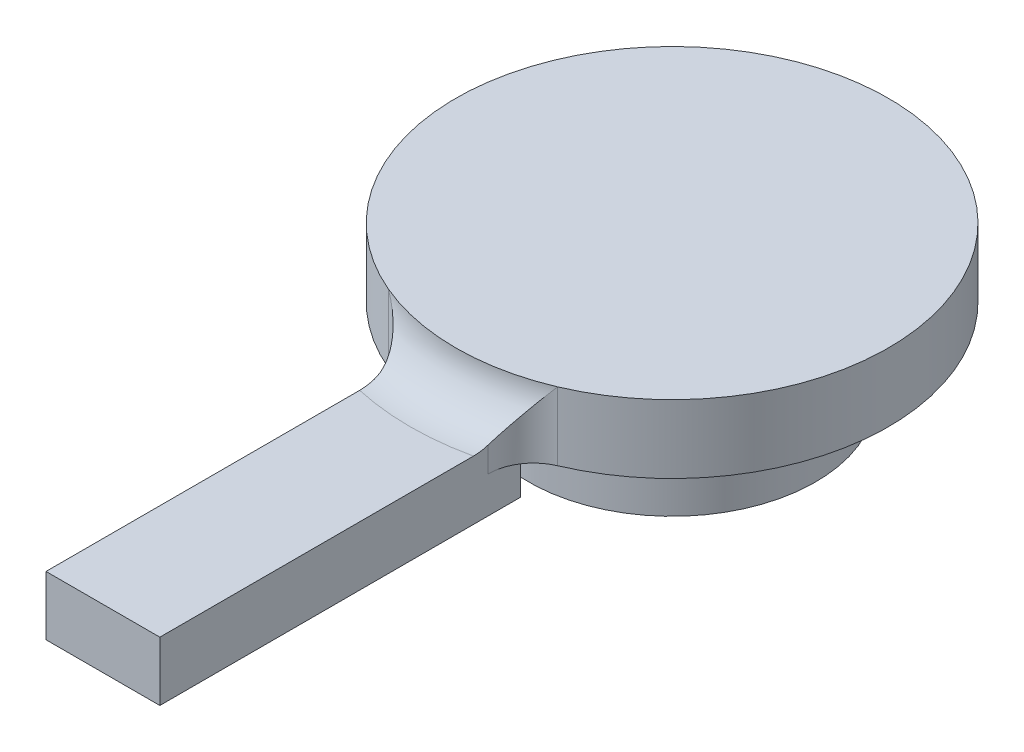
ISO-10303-21;
HEADER;
FILE_DESCRIPTION(('STEP AP214'),'2;1');
FILE_NAME('part.step','',(''),(''),'','','');
FILE_SCHEMA(('AUTOMOTIVE_DESIGN { 1 0 10303 214 1 1 1 1 }'));
ENDSEC;
DATA;
#1=APPLICATION_CONTEXT('core data for automotive mechanical design processes');
#2=APPLICATION_PROTOCOL_DEFINITION('international standard','automotive_design',2000,#1);
#3=PRODUCT_CONTEXT('',#1,'mechanical');
#4=PRODUCT('Part','Part','',(#3));
#5=PRODUCT_RELATED_PRODUCT_CATEGORY('part','',(#4));
#6=PRODUCT_DEFINITION_FORMATION('','',#4);
#7=PRODUCT_DEFINITION_CONTEXT('part definition',#1,'design');
#8=PRODUCT_DEFINITION('design','',#6,#7);
#9=PRODUCT_DEFINITION_SHAPE('','',#8);
#10=(LENGTH_UNIT() NAMED_UNIT(*) SI_UNIT(.MILLI.,.METRE.));
#11=(NAMED_UNIT(*) PLANE_ANGLE_UNIT() SI_UNIT($,.RADIAN.));
#12=(NAMED_UNIT(*) SI_UNIT($,.STERADIAN.) SOLID_ANGLE_UNIT());
#13=UNCERTAINTY_MEASURE_WITH_UNIT(LENGTH_MEASURE(1.E-05),#10,'distance_accuracy_value','');
#14=(GEOMETRIC_REPRESENTATION_CONTEXT(3) GLOBAL_UNCERTAINTY_ASSIGNED_CONTEXT((#13)) GLOBAL_UNIT_ASSIGNED_CONTEXT((#10,
#11,#12)) REPRESENTATION_CONTEXT('',''));
#15=CARTESIAN_POINT('',(0.,0.,0.));
#16=DIRECTION('',(0.,0.,1.));
#17=DIRECTION('',(1.,0.,0.));
#18=AXIS2_PLACEMENT_3D('',#15,#16,#17);
#19=CARTESIAN_POINT('',(0.,3.,0.));
#20=DIRECTION('',(0.,-1.,0.));
#21=DIRECTION('',(0.,0.,-1.));
#22=AXIS2_PLACEMENT_3D('',#19,#20,#21);
#23=CYLINDRICAL_SURFACE('',#22,9.5);
#24=CARTESIAN_POINT('',(0.,3.,0.));
#25=DIRECTION('',(0.,1.,0.));
#26=DIRECTION('',(0.,0.,1.));
#27=AXIS2_PLACEMENT_3D('',#24,#25,#26);
#28=CIRCLE('',#27,9.5);
#29=CARTESIAN_POINT('',(3.71739130434783,3.,8.742482593083));
#30=VERTEX_POINT('',#29);
#31=CARTESIAN_POINT('',(-3.71739130434783,3.,8.742482593083));
#32=VERTEX_POINT('',#31);
#33=EDGE_CURVE('E158',#30,#32,#28,.T.);
#34=ORIENTED_EDGE('',*,*,#33,.F.);
#35=DIRECTION('',(0.,-1.,0.));
#36=VECTOR('',#35,1.);
#37=CARTESIAN_POINT('',(3.71739130434783,3.,8.742482593083));
#38=LINE('',#37,#36);
#39=CARTESIAN_POINT('',(3.71739130434783,0.,8.742482593083));
#40=VERTEX_POINT('',#39);
#41=EDGE_CURVE('E227',#30,#40,#38,.T.);
#42=ORIENTED_EDGE('',*,*,#41,.T.);
#43=CARTESIAN_POINT('',(0.,0.,0.));
#44=DIRECTION('',(0.,1.,0.));
#45=DIRECTION('',(0.,0.,1.));
#46=AXIS2_PLACEMENT_3D('',#43,#44,#45);
#47=CIRCLE('',#46,9.5);
#48=CARTESIAN_POINT('',(-3.71739130434783,0.,8.742482593083));
#49=VERTEX_POINT('',#48);
#50=EDGE_CURVE('E163',#40,#49,#47,.T.);
#51=ORIENTED_EDGE('',*,*,#50,.T.);
#52=DIRECTION('',(0.,-1.,0.));
#53=VECTOR('',#52,1.);
#54=CARTESIAN_POINT('',(-3.71739130434783,3.,8.742482593083));
#55=LINE('',#54,#53);
#56=EDGE_CURVE('E230',#49,#32,#55,.F.);
#57=ORIENTED_EDGE('',*,*,#56,.T.);
#58=EDGE_LOOP('',(#34,#42,#51,#57));
#59=FACE_BOUND('',#58,.T.);
#60=ADVANCED_FACE('F41',(#59),#23,.T.);
#61=CARTESIAN_POINT('',(0.,3.,0.));
#62=DIRECTION('',(0.,1.,0.));
#63=DIRECTION('',(0.,0.,1.));
#64=AXIS2_PLACEMENT_3D('',#61,#62,#63);
#65=PLANE('',#64);
#66=EDGE_CURVE('E162',#32,#30,#28,.T.);
#67=ORIENTED_EDGE('',*,*,#66,.T.);
#68=ORIENTED_EDGE('',*,*,#33,.T.);
#69=EDGE_LOOP('',(#67,#68));
#70=FACE_BOUND('',#69,.T.);
#71=ADVANCED_FACE('F212',(#70),#65,.T.);
#72=CARTESIAN_POINT('',(0.,0.,0.));
#73=DIRECTION('',(0.,1.,0.));
#74=DIRECTION('',(0.,0.,1.));
#75=AXIS2_PLACEMENT_3D('',#72,#73,#74);
#76=PLANE('',#75);
#77=CARTESIAN_POINT('',(0.,0.,0.));
#78=DIRECTION('',(0.,-1.,0.));
#79=DIRECTION('',(0.,0.,-1.));
#80=AXIS2_PLACEMENT_3D('',#77,#78,#79);
#81=CIRCLE('',#80,7.6);
#82=CARTESIAN_POINT('',(0.,0.,-7.6));
#83=VERTEX_POINT('',#82);
#84=EDGE_CURVE('E117',#83,#83,#81,.T.);
#85=ORIENTED_EDGE('',*,*,#84,.F.);
#86=EDGE_LOOP('',(#85));
#87=FACE_BOUND('',#86,.T.);
#88=ORIENTED_EDGE('',*,*,#50,.F.);
#89=CARTESIAN_POINT('',(4.5,0.,10.5830052442584));
#90=DIRECTION('',(0.,1.,0.));
#91=DIRECTION('',(0.,0.,1.));
#92=AXIS2_PLACEMENT_3D('',#89,#90,#91);
#93=CIRCLE('',#92,2.);
#94=CARTESIAN_POINT('',(2.5,0.,10.5830052442584));
#95=VERTEX_POINT('',#94);
#96=EDGE_CURVE('E240',#40,#95,#93,.T.);
#97=ORIENTED_EDGE('',*,*,#96,.T.);
#98=DIRECTION('',(0.,0.,1.));
#99=VECTOR('',#98,1.);
#100=CARTESIAN_POINT('',(2.5,0.,0.));
#101=LINE('',#100,#99);
#102=CARTESIAN_POINT('',(2.5,0.,9.16515138991168));
#103=VERTEX_POINT('',#102);
#104=EDGE_CURVE('E59',#103,#95,#101,.T.);
#105=ORIENTED_EDGE('',*,*,#104,.F.);
#106=CARTESIAN_POINT('',(-2.5,0.,9.16515138991168));
#107=VERTEX_POINT('',#106);
#108=EDGE_CURVE('E115',#107,#103,#47,.T.);
#109=ORIENTED_EDGE('',*,*,#108,.F.);
#110=DIRECTION('',(0.,0.,-1.));
#111=VECTOR('',#110,1.);
#112=CARTESIAN_POINT('',(-2.5,0.,0.));
#113=LINE('',#112,#111);
#114=CARTESIAN_POINT('',(-2.5,0.,10.5830052442584));
#115=VERTEX_POINT('',#114);
#116=EDGE_CURVE('E245',#115,#107,#113,.T.);
#117=ORIENTED_EDGE('',*,*,#116,.F.);
#118=CARTESIAN_POINT('',(-4.5,0.,10.5830052442584));
#119=DIRECTION('',(0.,1.,0.));
#120=DIRECTION('',(0.,0.,1.));
#121=AXIS2_PLACEMENT_3D('',#118,#119,#120);
#122=CIRCLE('',#121,2.);
#123=EDGE_CURVE('E11',#115,#49,#122,.T.);
#124=ORIENTED_EDGE('',*,*,#123,.T.);
#125=EDGE_LOOP('',(#88,#97,#105,#109,#117,#124));
#126=FACE_BOUND('',#125,.T.);
#127=ADVANCED_FACE('F210',(#87,#126),#76,.F.);
#128=CARTESIAN_POINT('',(0.,0.5,0.));
#129=DIRECTION('',(0.,-1.,0.));
#130=DIRECTION('',(0.,0.,-1.));
#131=AXIS2_PLACEMENT_3D('',#128,#129,#130);
#132=CYLINDRICAL_SURFACE('',#131,7.6);
#133=CARTESIAN_POINT('',(0.,0.5,0.));
#134=DIRECTION('',(0.,-1.,0.));
#135=DIRECTION('',(0.,0.,-1.));
#136=AXIS2_PLACEMENT_3D('',#133,#134,#135);
#137=CIRCLE('',#136,7.6);
#138=CARTESIAN_POINT('',(0.,0.5,-7.6));
#139=VERTEX_POINT('',#138);
#140=EDGE_CURVE('E153',#139,#139,#137,.T.);
#141=ORIENTED_EDGE('',*,*,#140,.F.);
#142=EDGE_LOOP('',(#141));
#143=FACE_BOUND('',#142,.T.);
#144=ORIENTED_EDGE('',*,*,#84,.T.);
#145=EDGE_LOOP('',(#144));
#146=FACE_BOUND('',#145,.T.);
#147=ADVANCED_FACE('F206',(#143,#146),#132,.F.);
#148=CARTESIAN_POINT('',(0.,0.5,0.));
#149=DIRECTION('',(0.,-1.,0.));
#150=DIRECTION('',(0.,0.,-1.));
#151=AXIS2_PLACEMENT_3D('',#148,#149,#150);
#152=PLANE('',#151);
#153=CARTESIAN_POINT('',(0.,0.5,0.));
#154=DIRECTION('',(0.,-1.,0.));
#155=DIRECTION('',(0.,0.,-1.));
#156=AXIS2_PLACEMENT_3D('',#153,#154,#155);
#157=CIRCLE('',#156,6.3);
#158=CARTESIAN_POINT('',(0.,0.5,-6.3));
#159=VERTEX_POINT('',#158);
#160=EDGE_CURVE('E137',#159,#159,#157,.T.);
#161=ORIENTED_EDGE('',*,*,#160,.F.);
#162=EDGE_LOOP('',(#161));
#163=FACE_BOUND('',#162,.T.);
#164=ORIENTED_EDGE('',*,*,#140,.T.);
#165=EDGE_LOOP('',(#164));
#166=FACE_BOUND('',#165,.T.);
#167=ADVANCED_FACE('F203',(#163,#166),#152,.T.);
#168=CARTESIAN_POINT('',(0.,-1.6,0.));
#169=DIRECTION('',(0.,1.,0.));
#170=DIRECTION('',(0.,0.,1.));
#171=AXIS2_PLACEMENT_3D('',#168,#169,#170);
#172=CYLINDRICAL_SURFACE('',#171,9.5);
#173=ORIENTED_EDGE('',*,*,#108,.T.);
#174=DIRECTION('',(0.,1.,0.));
#175=VECTOR('',#174,1.);
#176=CARTESIAN_POINT('',(2.5,-1.6,9.16515138991168));
#177=LINE('',#176,#175);
#178=CARTESIAN_POINT('',(2.5,-1.6,9.16515138991168));
#179=VERTEX_POINT('',#178);
#180=EDGE_CURVE('E108',#179,#103,#177,.T.);
#181=ORIENTED_EDGE('',*,*,#180,.F.);
#182=CARTESIAN_POINT('',(0.,-1.6,0.));
#183=DIRECTION('',(0.,-1.,0.));
#184=DIRECTION('',(0.,0.,-1.));
#185=AXIS2_PLACEMENT_3D('',#182,#183,#184);
#186=CIRCLE('',#185,9.5);
#187=CARTESIAN_POINT('',(-2.5,-1.6,9.16515138991168));
#188=VERTEX_POINT('',#187);
#189=EDGE_CURVE('E113',#179,#188,#186,.T.);
#190=ORIENTED_EDGE('',*,*,#189,.T.);
#191=DIRECTION('',(0.,1.,0.));
#192=VECTOR('',#191,1.);
#193=CARTESIAN_POINT('',(-2.5,-1.6,9.16515138991168));
#194=LINE('',#193,#192);
#195=EDGE_CURVE('E142',#188,#107,#194,.T.);
#196=ORIENTED_EDGE('',*,*,#195,.T.);
#197=EDGE_LOOP('',(#173,#181,#190,#196));
#198=FACE_BOUND('',#197,.T.);
#199=ADVANCED_FACE('F110',(#198),#172,.F.);
#200=CARTESIAN_POINT('',(2.5,-1.6,0.));
#201=DIRECTION('',(-1.,0.,0.));
#202=DIRECTION('',(0.,0.,1.));
#203=AXIS2_PLACEMENT_3D('',#200,#201,#202);
#204=PLANE('',#203);
#205=ORIENTED_EDGE('',*,*,#104,.T.);
#206=DIRECTION('',(0.,1.,0.));
#207=VECTOR('',#206,1.);
#208=CARTESIAN_POINT('',(2.5,3.,10.5830052442584));
#209=LINE('',#208,#207);
#210=CARTESIAN_POINT('',(2.5,1.10040097238581,10.5830052442584));
#211=VERTEX_POINT('',#210);
#212=EDGE_CURVE('E248',#95,#211,#209,.T.);
#213=ORIENTED_EDGE('',*,*,#212,.T.);
#214=CARTESIAN_POINT('',(2.5,3.,9.16515138991168));
#215=CARTESIAN_POINT('',(2.5,2.94507948967621,9.16515048175511));
#216=CARTESIAN_POINT('',(2.5,2.89018591560524,9.16749780190774));
#217=CARTESIAN_POINT('',(2.5,2.78080468785167,9.17685365674659));
#218=CARTESIAN_POINT('',(2.5,2.72631698136846,9.18386157402017));
#219=CARTESIAN_POINT('',(2.5,2.56426323291039,9.21177358475455));
#220=CARTESIAN_POINT('',(2.5,2.45780396812137,9.23956638078001));
#221=CARTESIAN_POINT('',(2.5,2.25109972983604,9.31256230521273));
#222=CARTESIAN_POINT('',(2.5,2.1508551906533,9.3577666488302));
#223=CARTESIAN_POINT('',(2.5,1.95917981073917,9.46409101336274));
#224=CARTESIAN_POINT('',(2.5,1.86775031263618,9.52521345354943));
#225=CARTESIAN_POINT('',(2.5,1.6945785857672,9.6626335108321));
#226=CARTESIAN_POINT('',(2.5,1.61302674270591,9.73917070309158));
#227=CARTESIAN_POINT('',(2.5,1.46342673767224,9.90448170829992));
#228=CARTESIAN_POINT('',(2.5,1.39538216234534,9.99325876077783));
#229=CARTESIAN_POINT('',(2.5,1.27246764110905,10.1835802398452));
#230=CARTESIAN_POINT('',(2.5,1.21809120196434,10.2854432186382));
#231=CARTESIAN_POINT('',(2.5,1.12679127317599,10.496696281118));
#232=CARTESIAN_POINT('',(2.5,1.08986292590693,10.6060842600846));
#233=CARTESIAN_POINT('',(2.5,1.04150387807019,10.8006361748785));
#234=CARTESIAN_POINT('',(2.5,1.02595979460194,10.884802842851));
#235=CARTESIAN_POINT('',(2.5,1.00520657592899,11.0542933628545));
#236=CARTESIAN_POINT('',(2.5,0.999984556889041,11.1396156382978));
#237=CARTESIAN_POINT('',(2.5,1.,11.2249721603218));
#238=B_SPLINE_CURVE_WITH_KNOTS('',3,(#214,#215,#216,#217,#218,#219,#220,#221,#222,#223,#224,
#225,#226,#227,#228,#229,#230,#231,#232,#233,#234,#235,#236,#237),.UNSPECIFIED.,.F.,.F.,(4,2,2,
2,2,2,2,2,2,2,2,4),(0.,0.164658231389705,0.329294654022611,0.657671501485732,0.986071271622932,
1.31452098192498,1.64853582294687,1.9826392381368,2.32747665339377,2.67221800774815,
2.92838367390356,3.18422939576872),.UNSPECIFIED.);
#239=CARTESIAN_POINT('',(2.5,1.,11.2249721603218));
#240=VERTEX_POINT('',#239);
#241=EDGE_CURVE('E177',#211,#240,#238,.T.);
#242=ORIENTED_EDGE('',*,*,#241,.T.);
#243=DIRECTION('',(0.,0.,1.));
#244=VECTOR('',#243,1.);
#245=CARTESIAN_POINT('',(2.5,1.,0.));
#246=LINE('',#245,#244);
#247=CARTESIAN_POINT('',(2.5,1.,25.));
#248=VERTEX_POINT('',#247);
#249=EDGE_CURVE('E143',#240,#248,#246,.T.);
#250=ORIENTED_EDGE('',*,*,#249,.T.);
#251=DIRECTION('',(0.,1.,0.));
#252=VECTOR('',#251,1.);
#253=CARTESIAN_POINT('',(2.5,-1.6,25.));
#254=LINE('',#253,#252);
#255=CARTESIAN_POINT('',(2.5,-1.6,25.));
#256=VERTEX_POINT('',#255);
#257=EDGE_CURVE('E118',#256,#248,#254,.T.);
#258=ORIENTED_EDGE('',*,*,#257,.F.);
#259=DIRECTION('',(0.,0.,1.));
#260=VECTOR('',#259,1.);
#261=CARTESIAN_POINT('',(2.5,-1.6,0.));
#262=LINE('',#261,#260);
#263=EDGE_CURVE('E121',#179,#256,#262,.T.);
#264=ORIENTED_EDGE('',*,*,#263,.F.);
#265=ORIENTED_EDGE('',*,*,#180,.T.);
#266=EDGE_LOOP('',(#205,#213,#242,#250,#258,#264,#265));
#267=FACE_BOUND('',#266,.T.);
#268=ADVANCED_FACE('F122',(#267),#204,.F.);
#269=CARTESIAN_POINT('',(0.,-1.6,25.));
#270=DIRECTION('',(0.,0.,1.));
#271=DIRECTION('',(1.,0.,0.));
#272=AXIS2_PLACEMENT_3D('',#269,#270,#271);
#273=PLANE('',#272);
#274=DIRECTION('',(1.,0.,0.));
#275=VECTOR('',#274,1.);
#276=CARTESIAN_POINT('',(0.,1.,25.));
#277=LINE('',#276,#275);
#278=CARTESIAN_POINT('',(-2.5,1.,25.));
#279=VERTEX_POINT('',#278);
#280=EDGE_CURVE('E134',#279,#248,#277,.T.);
#281=ORIENTED_EDGE('',*,*,#280,.F.);
#282=DIRECTION('',(0.,1.,0.));
#283=VECTOR('',#282,1.);
#284=CARTESIAN_POINT('',(-2.5,-1.6,25.));
#285=LINE('',#284,#283);
#286=CARTESIAN_POINT('',(-2.5,-1.6,25.));
#287=VERTEX_POINT('',#286);
#288=EDGE_CURVE('E149',#287,#279,#285,.T.);
#289=ORIENTED_EDGE('',*,*,#288,.F.);
#290=DIRECTION('',(1.,0.,0.));
#291=VECTOR('',#290,1.);
#292=CARTESIAN_POINT('',(0.,-1.6,25.));
#293=LINE('',#292,#291);
#294=EDGE_CURVE('E127',#287,#256,#293,.T.);
#295=ORIENTED_EDGE('',*,*,#294,.T.);
#296=ORIENTED_EDGE('',*,*,#257,.T.);
#297=EDGE_LOOP('',(#281,#289,#295,#296));
#298=FACE_BOUND('',#297,.T.);
#299=ADVANCED_FACE('F192',(#298),#273,.T.);
#300=CARTESIAN_POINT('',(-2.5,-1.6,0.));
#301=DIRECTION('',(-1.,0.,0.));
#302=DIRECTION('',(0.,0.,1.));
#303=AXIS2_PLACEMENT_3D('',#300,#301,#302);
#304=PLANE('',#303);
#305=CARTESIAN_POINT('',(-2.5,1.,11.2249721603218));
#306=CARTESIAN_POINT('',(-2.5,1.00000105718365,11.1659064639501));
#307=CARTESIAN_POINT('',(-2.5,1.00249435344201,11.106869631491));
#308=CARTESIAN_POINT('',(-2.5,1.01243445169751,10.9892169178784));
#309=CARTESIAN_POINT('',(-2.5,1.0198810489431,10.9306010194261));
#310=CARTESIAN_POINT('',(-2.5,1.0495822076744,10.7560540518627));
#311=CARTESIAN_POINT('',(-2.5,1.07919829099557,10.6412883033866));
#312=CARTESIAN_POINT('',(-2.5,1.15727625916211,10.4183508634756));
#313=CARTESIAN_POINT('',(-2.5,1.20574788253638,10.3101826129733));
#314=CARTESIAN_POINT('',(-2.5,1.32027896512709,10.1036004758037));
#315=CARTESIAN_POINT('',(-2.5,1.38633381520257,10.0051840421293));
#316=CARTESIAN_POINT('',(-2.5,1.53377919711974,9.82176586312826));
#317=CARTESIAN_POINT('',(-2.5,1.6150552915134,9.73667219492719));
#318=CARTESIAN_POINT('',(-2.5,1.79110927376422,9.58176647397337));
#319=CARTESIAN_POINT('',(-2.5,1.88588857138797,9.51195601875728));
#320=CARTESIAN_POINT('',(-2.5,2.08359101628214,9.39167102590288));
#321=CARTESIAN_POINT('',(-2.5,2.18623428946876,9.34073608223342));
#322=CARTESIAN_POINT('',(-2.5,2.39877131830615,9.25752004144949));
#323=CARTESIAN_POINT('',(-2.5,2.50865697168293,9.22521848042353));
#324=CARTESIAN_POINT('',(-2.5,2.68292303391411,9.19030106898049));
#325=CARTESIAN_POINT('',(-2.5,2.7460116192046,9.18087611833152));
#326=CARTESIAN_POINT('',(-2.5,2.87272266164224,9.16830326305873));
#327=CARTESIAN_POINT('',(-2.5,2.93634425866494,9.16514668550634));
#328=CARTESIAN_POINT('',(-2.5,3.,9.16515138991168));
#329=B_SPLINE_CURVE_WITH_KNOTS('',3,(#305,#306,#307,#308,#309,#310,#311,#312,#313,#314,#315,
#316,#317,#318,#319,#320,#321,#322,#323,#324,#325,#326,#327,#328),.UNSPECIFIED.,.F.,.F.,(4,2,2,
2,2,2,2,2,2,2,2,4),(0.,0.177087491450069,0.354167663198444,0.707926929864555,1.0618691495899,
1.41571868064956,1.76700754271795,2.11833310709275,2.46041525188767,2.80212098987973,
2.99320787399041,3.1840301853339),.UNSPECIFIED.);
#330=CARTESIAN_POINT('',(-2.5,1.,11.2249721603218));
#331=VERTEX_POINT('',#330);
#332=CARTESIAN_POINT('',(-2.5,1.10040097238581,10.5830052442584));
#333=VERTEX_POINT('',#332);
#334=EDGE_CURVE('E168',#331,#333,#329,.T.);
#335=ORIENTED_EDGE('',*,*,#334,.T.);
#336=DIRECTION('',(0.,-1.,0.));
#337=VECTOR('',#336,1.);
#338=CARTESIAN_POINT('',(-2.5,-1.6,10.5830052442584));
#339=LINE('',#338,#337);
#340=EDGE_CURVE('E241',#333,#115,#339,.T.);
#341=ORIENTED_EDGE('',*,*,#340,.T.);
#342=ORIENTED_EDGE('',*,*,#116,.T.);
#343=ORIENTED_EDGE('',*,*,#195,.F.);
#344=DIRECTION('',(0.,0.,1.));
#345=VECTOR('',#344,1.);
#346=CARTESIAN_POINT('',(-2.5,-1.6,0.));
#347=LINE('',#346,#345);
#348=EDGE_CURVE('E131',#188,#287,#347,.T.);
#349=ORIENTED_EDGE('',*,*,#348,.T.);
#350=ORIENTED_EDGE('',*,*,#288,.T.);
#351=DIRECTION('',(0.,0.,1.));
#352=VECTOR('',#351,1.);
#353=CARTESIAN_POINT('',(-2.5,1.,0.));
#354=LINE('',#353,#352);
#355=EDGE_CURVE('E132',#331,#279,#354,.T.);
#356=ORIENTED_EDGE('',*,*,#355,.F.);
#357=EDGE_LOOP('',(#335,#341,#342,#343,#349,#350,#356));
#358=FACE_BOUND('',#357,.T.);
#359=ADVANCED_FACE('F187',(#358),#304,.T.);
#360=CARTESIAN_POINT('',(0.,-1.6,0.));
#361=DIRECTION('',(0.,-1.,0.));
#362=DIRECTION('',(0.,0.,-1.));
#363=AXIS2_PLACEMENT_3D('',#360,#361,#362);
#364=PLANE('',#363);
#365=CARTESIAN_POINT('',(0.,-1.6,17.0825756949558));
#366=DIRECTION('',(0.,-1.,0.));
#367=DIRECTION('',(0.,0.,-1.));
#368=AXIS2_PLACEMENT_3D('',#365,#366,#367);
#369=CIRCLE('',#368,0.6);
#370=CARTESIAN_POINT('',(0.,-1.6,16.4825756949558));
#371=VERTEX_POINT('',#370);
#372=EDGE_CURVE('E303',#371,#371,#369,.T.);
#373=ORIENTED_EDGE('',*,*,#372,.F.);
#374=EDGE_LOOP('',(#373));
#375=FACE_BOUND('',#374,.T.);
#376=ORIENTED_EDGE('',*,*,#189,.F.);
#377=ORIENTED_EDGE('',*,*,#263,.T.);
#378=ORIENTED_EDGE('',*,*,#294,.F.);
#379=ORIENTED_EDGE('',*,*,#348,.F.);
#380=EDGE_LOOP('',(#376,#377,#378,#379));
#381=FACE_BOUND('',#380,.T.);
#382=ADVANCED_FACE('F129',(#375,#381),#364,.T.);
#383=CARTESIAN_POINT('',(0.,1.,0.));
#384=DIRECTION('',(0.,-1.,0.));
#385=DIRECTION('',(0.,0.,-1.));
#386=AXIS2_PLACEMENT_3D('',#383,#384,#385);
#387=PLANE('',#386);
#388=ORIENTED_EDGE('',*,*,#249,.F.);
#389=CARTESIAN_POINT('',(0.,1.,0.));
#390=DIRECTION('',(0.,-1.,0.));
#391=DIRECTION('',(0.,0.,-1.));
#392=AXIS2_PLACEMENT_3D('',#389,#390,#391);
#393=CIRCLE('',#392,11.5);
#394=EDGE_CURVE('E161',#240,#331,#393,.T.);
#395=ORIENTED_EDGE('',*,*,#394,.T.);
#396=ORIENTED_EDGE('',*,*,#355,.T.);
#397=ORIENTED_EDGE('',*,*,#280,.T.);
#398=EDGE_LOOP('',(#388,#395,#396,#397));
#399=FACE_BOUND('',#398,.T.);
#400=ADVANCED_FACE('F194',(#399),#387,.F.);
#401=CARTESIAN_POINT('',(0.,-3.7,0.));
#402=DIRECTION('',(0.,1.,0.));
#403=DIRECTION('',(0.,0.,1.));
#404=AXIS2_PLACEMENT_3D('',#401,#402,#403);
#405=CYLINDRICAL_SURFACE('',#404,6.3);
#406=CARTESIAN_POINT('',(0.,-3.7,0.));
#407=DIRECTION('',(0.,-1.,0.));
#408=DIRECTION('',(0.,0.,-1.));
#409=AXIS2_PLACEMENT_3D('',#406,#407,#408);
#410=CIRCLE('',#409,6.3);
#411=CARTESIAN_POINT('',(0.,-3.7,-6.3));
#412=VERTEX_POINT('',#411);
#413=EDGE_CURVE('E145',#412,#412,#410,.T.);
#414=ORIENTED_EDGE('',*,*,#413,.F.);
#415=EDGE_LOOP('',(#414));
#416=FACE_BOUND('',#415,.T.);
#417=ORIENTED_EDGE('',*,*,#160,.T.);
#418=EDGE_LOOP('',(#417));
#419=FACE_BOUND('',#418,.T.);
#420=ADVANCED_FACE('F290',(#416,#419),#405,.T.);
#421=CARTESIAN_POINT('',(0.,-3.7,0.));
#422=DIRECTION('',(0.,-1.,0.));
#423=DIRECTION('',(0.,0.,-1.));
#424=AXIS2_PLACEMENT_3D('',#421,#422,#423);
#425=PLANE('',#424);
#426=CARTESIAN_POINT('',(0.,-3.7,0.));
#427=DIRECTION('',(0.,-1.,0.));
#428=DIRECTION('',(0.,0.,-1.));
#429=AXIS2_PLACEMENT_3D('',#426,#427,#428);
#430=CIRCLE('',#429,1.);
#431=CARTESIAN_POINT('',(0.,-3.7,-1.));
#432=VERTEX_POINT('',#431);
#433=EDGE_CURVE('E307',#432,#432,#430,.T.);
#434=ORIENTED_EDGE('',*,*,#433,.F.);
#435=EDGE_LOOP('',(#434));
#436=FACE_BOUND('',#435,.T.);
#437=ORIENTED_EDGE('',*,*,#413,.T.);
#438=EDGE_LOOP('',(#437));
#439=FACE_BOUND('',#438,.T.);
#440=ADVANCED_FACE('F286',(#436,#439),#425,.T.);
#441=CARTESIAN_POINT('',(0.,1.3,0.));
#442=DIRECTION('',(0.,-1.,0.));
#443=DIRECTION('',(0.,0.,-1.));
#444=AXIS2_PLACEMENT_3D('',#441,#442,#443);
#445=CYLINDRICAL_SURFACE('',#444,1.);
#446=CARTESIAN_POINT('',(0.,1.3,0.));
#447=DIRECTION('',(0.,-1.,0.));
#448=DIRECTION('',(0.,0.,-1.));
#449=AXIS2_PLACEMENT_3D('',#446,#447,#448);
#450=CIRCLE('',#449,1.);
#451=CARTESIAN_POINT('',(0.,1.3,-1.));
#452=VERTEX_POINT('',#451);
#453=EDGE_CURVE('E310',#452,#452,#450,.T.);
#454=ORIENTED_EDGE('',*,*,#453,.F.);
#455=EDGE_LOOP('',(#454));
#456=FACE_BOUND('',#455,.T.);
#457=ORIENTED_EDGE('',*,*,#433,.T.);
#458=EDGE_LOOP('',(#457));
#459=FACE_BOUND('',#458,.T.);
#460=ADVANCED_FACE('F282',(#456,#459),#445,.F.);
#461=CARTESIAN_POINT('',(0.,1.3,0.));
#462=DIRECTION('',(0.,-1.,0.));
#463=DIRECTION('',(0.,0.,-1.));
#464=AXIS2_PLACEMENT_3D('',#461,#462,#463);
#465=PLANE('',#464);
#466=ORIENTED_EDGE('',*,*,#453,.T.);
#467=EDGE_LOOP('',(#466));
#468=FACE_BOUND('',#467,.T.);
#469=ADVANCED_FACE('F275',(#468),#465,.T.);
#470=CARTESIAN_POINT('',(0.,0.799999999999999,17.0825756949558));
#471=DIRECTION('',(0.,-1.,0.));
#472=DIRECTION('',(0.,0.,-1.));
#473=AXIS2_PLACEMENT_3D('',#470,#471,#472);
#474=CYLINDRICAL_SURFACE('',#473,0.6);
#475=CARTESIAN_POINT('',(0.,0.799999999999999,17.0825756949558));
#476=DIRECTION('',(0.,-1.,0.));
#477=DIRECTION('',(0.,0.,-1.));
#478=AXIS2_PLACEMENT_3D('',#475,#476,#477);
#479=CIRCLE('',#478,0.6);
#480=CARTESIAN_POINT('',(0.,0.799999999999999,16.4825756949558));
#481=VERTEX_POINT('',#480);
#482=EDGE_CURVE('E305',#481,#481,#479,.T.);
#483=ORIENTED_EDGE('',*,*,#482,.F.);
#484=EDGE_LOOP('',(#483));
#485=FACE_BOUND('',#484,.T.);
#486=ORIENTED_EDGE('',*,*,#372,.T.);
#487=EDGE_LOOP('',(#486));
#488=FACE_BOUND('',#487,.T.);
#489=ADVANCED_FACE('F269',(#485,#488),#474,.F.);
#490=CARTESIAN_POINT('',(0.,0.799999999999999,17.0825756949558));
#491=DIRECTION('',(0.,-1.,0.));
#492=DIRECTION('',(0.,0.,-1.));
#493=AXIS2_PLACEMENT_3D('',#490,#491,#492);
#494=PLANE('',#493);
#495=ORIENTED_EDGE('',*,*,#482,.T.);
#496=EDGE_LOOP('',(#495));
#497=FACE_BOUND('',#496,.T.);
#498=ADVANCED_FACE('F265',(#497),#494,.T.);
#499=CARTESIAN_POINT('',(0.,3.,0.));
#500=DIRECTION('',(0.,-1.,0.));
#501=DIRECTION('',(0.,0.,-1.));
#502=AXIS2_PLACEMENT_3D('',#499,#500,#501);
#503=TOROIDAL_SURFACE('',#502,11.5,2.);
#504=ORIENTED_EDGE('',*,*,#241,.F.);
#505=CARTESIAN_POINT('',(2.5,1.10040097238581,10.5830052442584));
#506=CARTESIAN_POINT('',(2.49999564146918,1.11763446024936,10.5292236232451));
#507=CARTESIAN_POINT('',(2.50216903937744,1.13688034478315,10.4761565541412));
#508=CARTESIAN_POINT('',(2.51048823850976,1.17892886968234,10.3718947420129));
#509=CARTESIAN_POINT('',(2.51662565498789,1.20172392573123,10.3206962874147));
#510=CARTESIAN_POINT('',(2.54021670443882,1.27421169178821,10.1715566385364));
#511=CARTESIAN_POINT('',(2.56287020088772,1.32848551756573,10.0766347741123));
#512=CARTESIAN_POINT('',(2.62707648686471,1.46255853427813,9.87109253598866));
#513=CARTESIAN_POINT('',(2.67214562470833,1.54524930417944,9.76352195473472));
#514=CARTESIAN_POINT('',(2.77572003721486,1.72091550754699,9.5633739880979));
#515=CARTESIAN_POINT('',(2.83431327507759,1.81395611069494,9.47090184016883));
#516=CARTESIAN_POINT('',(2.94440388384011,1.98059131734702,9.32357906875198));
#517=CARTESIAN_POINT('',(2.99360484437174,2.05272778473743,9.26528254831383));
#518=CARTESIAN_POINT('',(3.09650809571771,2.19947985136824,9.15617746678376));
#519=CARTESIAN_POINT('',(3.1502127453072,2.2740967372056,9.10537286844191));
#520=CARTESIAN_POINT('',(3.26133810693612,2.42480905116095,9.01105879065731));
#521=CARTESIAN_POINT('',(3.31875053015947,2.5009009322231,8.96753377008113));
#522=CARTESIAN_POINT('',(3.43693591705149,2.6540489815639,8.88742602753727));
#523=CARTESIAN_POINT('',(3.49770737525475,2.73110470607325,8.85084022758577));
#524=CARTESIAN_POINT('',(3.60967519284654,2.86995550223268,8.79122277357224));
#525=CARTESIAN_POINT('',(3.66030953321809,2.93167157601464,8.76694741576861));
#526=CARTESIAN_POINT('',(3.71370172435984,2.99558742745211,8.74405471939427));
#527=CARTESIAN_POINT('',(3.71554593110501,2.99779372118647,8.74326726726193));
#528=CARTESIAN_POINT('',(3.71739130434783,3.,8.742482593083));
#529=B_SPLINE_CURVE_WITH_KNOTS('',3,(#505,#506,#507,#508,#509,#510,#511,#512,#513,#514,#515,
#516,#517,#518,#519,#520,#521,#522,#523,#524,#525,#526,#527,#528),.UNSPECIFIED.,.F.,.F.,(4,2,2,
2,2,2,2,2,2,2,2,4),(0.,0.169237507718537,0.33811820913454,0.67141223626886,1.09805973392608,
1.52756458076626,1.84214425729157,2.15688973417667,2.47095443954586,2.78487950986281,
3.0350480057109,3.04399228219699),.UNSPECIFIED.);
#530=EDGE_CURVE('E234',#211,#30,#529,.T.);
#531=ORIENTED_EDGE('',*,*,#530,.T.);
#532=ORIENTED_EDGE('',*,*,#66,.F.);
#533=CARTESIAN_POINT('',(-2.5,1.10040097238581,10.5830052442584));
#534=CARTESIAN_POINT('',(-2.49999564146918,1.11763446024936,10.5292236232451));
#535=CARTESIAN_POINT('',(-2.50216903937744,1.13688034478315,10.4761565541412));
#536=CARTESIAN_POINT('',(-2.51048823850976,1.17892886968234,10.3718947420129));
#537=CARTESIAN_POINT('',(-2.51662565498789,1.20172392573123,10.3206962874147));
#538=CARTESIAN_POINT('',(-2.54021670443882,1.27421169178821,10.1715566385364));
#539=CARTESIAN_POINT('',(-2.56287020088772,1.32848551756573,10.0766347741123));
#540=CARTESIAN_POINT('',(-2.62707648686471,1.46255853427813,9.87109253598866));
#541=CARTESIAN_POINT('',(-2.67214562470833,1.54524930417944,9.76352195473472));
#542=CARTESIAN_POINT('',(-2.77572003721486,1.72091550754699,9.5633739880979));
#543=CARTESIAN_POINT('',(-2.83431327507759,1.81395611069494,9.47090184016883));
#544=CARTESIAN_POINT('',(-2.94440388384011,1.98059131734702,9.32357906875198));
#545=CARTESIAN_POINT('',(-2.99360484437174,2.05272778473743,9.26528254831383));
#546=CARTESIAN_POINT('',(-3.09650809571771,2.19947985136824,9.15617746678376));
#547=CARTESIAN_POINT('',(-3.1502127453072,2.2740967372056,9.10537286844191));
#548=CARTESIAN_POINT('',(-3.26133810693612,2.42480905116095,9.01105879065731));
#549=CARTESIAN_POINT('',(-3.31875053015947,2.5009009322231,8.96753377008113));
#550=CARTESIAN_POINT('',(-3.43693591705149,2.6540489815639,8.88742602753727));
#551=CARTESIAN_POINT('',(-3.49770737525475,2.73110470607325,8.85084022758577));
#552=CARTESIAN_POINT('',(-3.60967519284654,2.86995550223268,8.79122277357224));
#553=CARTESIAN_POINT('',(-3.66030953321809,2.93167157601464,8.76694741576861));
#554=CARTESIAN_POINT('',(-3.71370172435984,2.99558742745211,8.74405471939427));
#555=CARTESIAN_POINT('',(-3.71554593110501,2.99779372118647,8.74326726726193));
#556=CARTESIAN_POINT('',(-3.71739130434783,3.,8.742482593083));
#557=B_SPLINE_CURVE_WITH_KNOTS('',3,(#533,#534,#535,#536,#537,#538,#539,#540,#541,#542,#543,
#544,#545,#546,#547,#548,#549,#550,#551,#552,#553,#554,#555,#556),.UNSPECIFIED.,.F.,.F.,(4,2,2,
2,2,2,2,2,2,2,2,4),(0.,0.169237507718537,0.33811820913454,0.67141223626886,1.09805973392608,
1.52756458076626,1.84214425729157,2.15688973417667,2.47095443954586,2.78487950986281,
3.0350480057109,3.04399228219699),.UNSPECIFIED.);
#558=EDGE_CURVE('E51',#32,#333,#557,.F.);
#559=ORIENTED_EDGE('',*,*,#558,.T.);
#560=ORIENTED_EDGE('',*,*,#334,.F.);
#561=ORIENTED_EDGE('',*,*,#394,.F.);
#562=EDGE_LOOP('',(#504,#531,#532,#559,#560,#561));
#563=FACE_BOUND('',#562,.T.);
#564=ADVANCED_FACE('F184',(#563),#503,.F.);
#565=CARTESIAN_POINT('',(4.5,3.,10.5830052442584));
#566=DIRECTION('',(0.,-1.,0.));
#567=DIRECTION('',(0.,0.,-1.));
#568=AXIS2_PLACEMENT_3D('',#565,#566,#567);
#569=CYLINDRICAL_SURFACE('',#568,2.);
#570=ORIENTED_EDGE('',*,*,#96,.F.);
#571=ORIENTED_EDGE('',*,*,#41,.F.);
#572=ORIENTED_EDGE('',*,*,#530,.F.);
#573=ORIENTED_EDGE('',*,*,#212,.F.);
#574=EDGE_LOOP('',(#570,#571,#572,#573));
#575=FACE_BOUND('',#574,.T.);
#576=ADVANCED_FACE('F244',(#575),#569,.F.);
#577=CARTESIAN_POINT('',(-4.5,3.,10.5830052442584));
#578=DIRECTION('',(0.,-1.,0.));
#579=DIRECTION('',(0.,0.,-1.));
#580=AXIS2_PLACEMENT_3D('',#577,#578,#579);
#581=CYLINDRICAL_SURFACE('',#580,2.);
#582=ORIENTED_EDGE('',*,*,#123,.F.);
#583=ORIENTED_EDGE('',*,*,#340,.F.);
#584=ORIENTED_EDGE('',*,*,#558,.F.);
#585=ORIENTED_EDGE('',*,*,#56,.F.);
#586=EDGE_LOOP('',(#582,#583,#584,#585));
#587=FACE_BOUND('',#586,.T.);
#588=ADVANCED_FACE('F43',(#587),#581,.F.);
#589=CLOSED_SHELL('',(#60,#71,#127,#147,#167,#199,#268,#299,#359,#382,#400,#420,#440,#460,#469,
#489,#498,#564,#576,#588));
#590=MANIFOLD_SOLID_BREP('B2',#589);
#591=ADVANCED_BREP_SHAPE_REPRESENTATION('',(#18,#590),#14);
#592=SHAPE_DEFINITION_REPRESENTATION(#9,#591);
ENDSEC;
END-ISO-10303-21;
